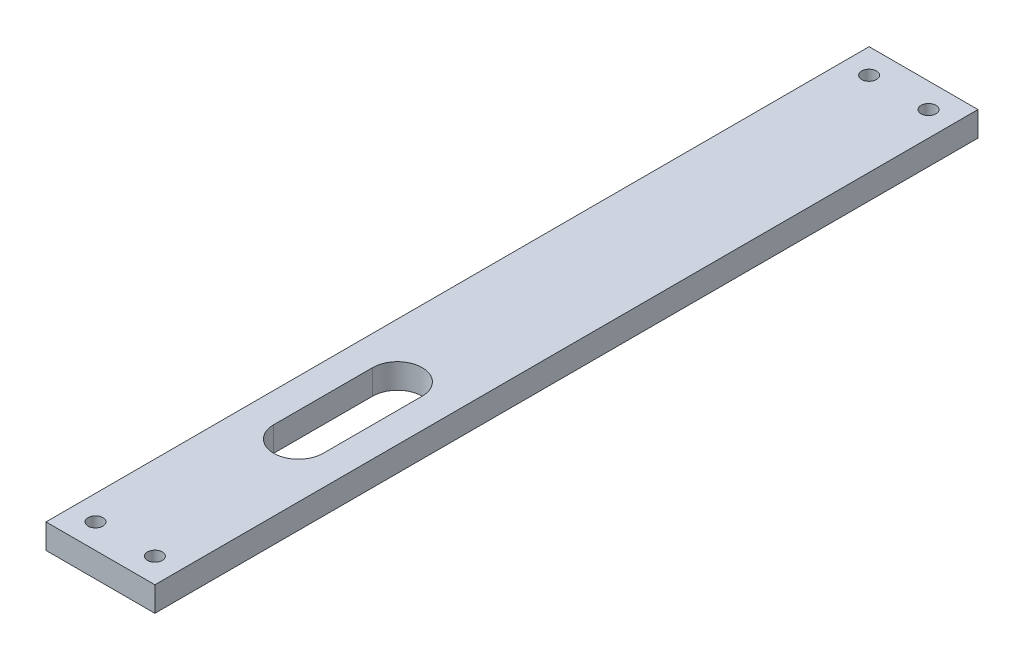
ISO-10303-21;
HEADER;
FILE_DESCRIPTION(('STEP AP214'),'2;1');
FILE_NAME('part.step','',(''),(''),'','','');
FILE_SCHEMA(('AUTOMOTIVE_DESIGN { 1 0 10303 214 1 1 1 1 }'));
ENDSEC;
DATA;
#1=APPLICATION_CONTEXT('core data for automotive mechanical design processes');
#2=APPLICATION_PROTOCOL_DEFINITION('international standard','automotive_design',2000,#1);
#3=PRODUCT_CONTEXT('',#1,'mechanical');
#4=PRODUCT('Part','Part','',(#3));
#5=PRODUCT_RELATED_PRODUCT_CATEGORY('part','',(#4));
#6=PRODUCT_DEFINITION_FORMATION('','',#4);
#7=PRODUCT_DEFINITION_CONTEXT('part definition',#1,'design');
#8=PRODUCT_DEFINITION('design','',#6,#7);
#9=PRODUCT_DEFINITION_SHAPE('','',#8);
#10=(LENGTH_UNIT() NAMED_UNIT(*) SI_UNIT(.MILLI.,.METRE.));
#11=(NAMED_UNIT(*) PLANE_ANGLE_UNIT() SI_UNIT($,.RADIAN.));
#12=(NAMED_UNIT(*) SI_UNIT($,.STERADIAN.) SOLID_ANGLE_UNIT());
#13=UNCERTAINTY_MEASURE_WITH_UNIT(LENGTH_MEASURE(1.E-05),#10,'distance_accuracy_value','');
#14=(GEOMETRIC_REPRESENTATION_CONTEXT(3) GLOBAL_UNCERTAINTY_ASSIGNED_CONTEXT((#13)) GLOBAL_UNIT_ASSIGNED_CONTEXT((#10,
#11,#12)) REPRESENTATION_CONTEXT('',''));
#15=CARTESIAN_POINT('',(0.,0.,0.));
#16=DIRECTION('',(0.,0.,1.));
#17=DIRECTION('',(1.,0.,0.));
#18=AXIS2_PLACEMENT_3D('',#15,#16,#17);
#19=CARTESIAN_POINT('',(22.,5.,0.));
#20=DIRECTION('',(-1.,0.,0.));
#21=DIRECTION('',(0.,0.,1.));
#22=AXIS2_PLACEMENT_3D('',#19,#20,#21);
#23=PLANE('',#22);
#24=DIRECTION('',(0.,0.,-1.));
#25=VECTOR('',#24,1.);
#26=CARTESIAN_POINT('',(22.,0.,0.));
#27=LINE('',#26,#25);
#28=CARTESIAN_POINT('',(22.,0.,0.));
#29=VERTEX_POINT('',#28);
#30=CARTESIAN_POINT('',(22.,0.,-166.3));
#31=VERTEX_POINT('',#30);
#32=EDGE_CURVE('E164',#29,#31,#27,.T.);
#33=ORIENTED_EDGE('',*,*,#32,.T.);
#34=DIRECTION('',(0.,-1.,0.));
#35=VECTOR('',#34,1.);
#36=CARTESIAN_POINT('',(22.,5.,-166.3));
#37=LINE('',#36,#35);
#38=CARTESIAN_POINT('',(22.,5.,-166.3));
#39=VERTEX_POINT('',#38);
#40=EDGE_CURVE('E11',#39,#31,#37,.T.);
#41=ORIENTED_EDGE('',*,*,#40,.F.);
#42=DIRECTION('',(0.,0.,-1.));
#43=VECTOR('',#42,1.);
#44=CARTESIAN_POINT('',(22.,5.,0.));
#45=LINE('',#44,#43);
#46=CARTESIAN_POINT('',(22.,5.,0.));
#47=VERTEX_POINT('',#46);
#48=EDGE_CURVE('E142',#47,#39,#45,.T.);
#49=ORIENTED_EDGE('',*,*,#48,.F.);
#50=DIRECTION('',(0.,-1.,0.));
#51=VECTOR('',#50,1.);
#52=CARTESIAN_POINT('',(22.,5.,0.));
#53=LINE('',#52,#51);
#54=EDGE_CURVE('E158',#47,#29,#53,.T.);
#55=ORIENTED_EDGE('',*,*,#54,.T.);
#56=EDGE_LOOP('',(#33,#41,#49,#55));
#57=FACE_BOUND('',#56,.T.);
#58=ADVANCED_FACE('F35',(#57),#23,.F.);
#59=CARTESIAN_POINT('',(0.,5.,-166.3));
#60=DIRECTION('',(0.,0.,-1.));
#61=DIRECTION('',(-1.,0.,0.));
#62=AXIS2_PLACEMENT_3D('',#59,#60,#61);
#63=PLANE('',#62);
#64=DIRECTION('',(1.,0.,0.));
#65=VECTOR('',#64,1.);
#66=CARTESIAN_POINT('',(0.,0.,-166.3));
#67=LINE('',#66,#65);
#68=CARTESIAN_POINT('',(0.,0.,-166.3));
#69=VERTEX_POINT('',#68);
#70=EDGE_CURVE('E167',#69,#31,#67,.T.);
#71=ORIENTED_EDGE('',*,*,#70,.F.);
#72=DIRECTION('',(0.,-1.,0.));
#73=VECTOR('',#72,1.);
#74=CARTESIAN_POINT('',(0.,5.,-166.3));
#75=LINE('',#74,#73);
#76=CARTESIAN_POINT('',(0.,5.,-166.3));
#77=VERTEX_POINT('',#76);
#78=EDGE_CURVE('E43',#77,#69,#75,.T.);
#79=ORIENTED_EDGE('',*,*,#78,.F.);
#80=DIRECTION('',(1.,0.,0.));
#81=VECTOR('',#80,1.);
#82=CARTESIAN_POINT('',(0.,5.,-166.3));
#83=LINE('',#82,#81);
#84=EDGE_CURVE('E144',#77,#39,#83,.T.);
#85=ORIENTED_EDGE('',*,*,#84,.T.);
#86=ORIENTED_EDGE('',*,*,#40,.T.);
#87=EDGE_LOOP('',(#71,#79,#85,#86));
#88=FACE_BOUND('',#87,.T.);
#89=ADVANCED_FACE('F190',(#88),#63,.T.);
#90=CARTESIAN_POINT('',(0.,5.,0.));
#91=DIRECTION('',(-1.,0.,0.));
#92=DIRECTION('',(0.,0.,1.));
#93=AXIS2_PLACEMENT_3D('',#90,#91,#92);
#94=PLANE('',#93);
#95=DIRECTION('',(0.,0.,-1.));
#96=VECTOR('',#95,1.);
#97=CARTESIAN_POINT('',(0.,0.,0.));
#98=LINE('',#97,#96);
#99=CARTESIAN_POINT('',(0.,0.,0.));
#100=VERTEX_POINT('',#99);
#101=EDGE_CURVE('E170',#100,#69,#98,.T.);
#102=ORIENTED_EDGE('',*,*,#101,.F.);
#103=DIRECTION('',(0.,-1.,0.));
#104=VECTOR('',#103,1.);
#105=CARTESIAN_POINT('',(0.,5.,0.));
#106=LINE('',#105,#104);
#107=CARTESIAN_POINT('',(0.,5.,0.));
#108=VERTEX_POINT('',#107);
#109=EDGE_CURVE('E182',#108,#100,#106,.T.);
#110=ORIENTED_EDGE('',*,*,#109,.F.);
#111=DIRECTION('',(0.,0.,-1.));
#112=VECTOR('',#111,1.);
#113=CARTESIAN_POINT('',(0.,5.,0.));
#114=LINE('',#113,#112);
#115=EDGE_CURVE('E147',#108,#77,#114,.T.);
#116=ORIENTED_EDGE('',*,*,#115,.T.);
#117=ORIENTED_EDGE('',*,*,#78,.T.);
#118=EDGE_LOOP('',(#102,#110,#116,#117));
#119=FACE_BOUND('',#118,.T.);
#120=ADVANCED_FACE('F186',(#119),#94,.T.);
#121=CARTESIAN_POINT('',(17.,5.,-5.));
#122=DIRECTION('',(0.,-1.,0.));
#123=DIRECTION('',(0.,0.,-1.));
#124=AXIS2_PLACEMENT_3D('',#121,#122,#123);
#125=CYLINDRICAL_SURFACE('',#124,1.5);
#126=CARTESIAN_POINT('',(17.,5.,-5.));
#127=DIRECTION('',(0.,1.,0.));
#128=DIRECTION('',(0.,0.,1.));
#129=AXIS2_PLACEMENT_3D('',#126,#127,#128);
#130=CIRCLE('',#129,1.5);
#131=CARTESIAN_POINT('',(17.,5.,-3.5));
#132=VERTEX_POINT('',#131);
#133=EDGE_CURVE('E152',#132,#132,#130,.F.);
#134=ORIENTED_EDGE('',*,*,#133,.F.);
#135=EDGE_LOOP('',(#134));
#136=FACE_BOUND('',#135,.T.);
#137=CARTESIAN_POINT('',(17.,0.,-5.));
#138=DIRECTION('',(0.,1.,0.));
#139=DIRECTION('',(0.,0.,1.));
#140=AXIS2_PLACEMENT_3D('',#137,#138,#139);
#141=CIRCLE('',#140,1.5);
#142=CARTESIAN_POINT('',(17.,0.,-3.5));
#143=VERTEX_POINT('',#142);
#144=EDGE_CURVE('E175',#143,#143,#141,.F.);
#145=ORIENTED_EDGE('',*,*,#144,.T.);
#146=EDGE_LOOP('',(#145));
#147=FACE_BOUND('',#146,.T.);
#148=ADVANCED_FACE('F242',(#136,#147),#125,.F.);
#149=CARTESIAN_POINT('',(0.,5.,0.));
#150=DIRECTION('',(0.,0.,-1.));
#151=DIRECTION('',(-1.,0.,0.));
#152=AXIS2_PLACEMENT_3D('',#149,#150,#151);
#153=PLANE('',#152);
#154=DIRECTION('',(1.,0.,0.));
#155=VECTOR('',#154,1.);
#156=CARTESIAN_POINT('',(0.,0.,0.));
#157=LINE('',#156,#155);
#158=EDGE_CURVE('E173',#100,#29,#157,.T.);
#159=ORIENTED_EDGE('',*,*,#158,.T.);
#160=ORIENTED_EDGE('',*,*,#54,.F.);
#161=DIRECTION('',(1.,0.,0.));
#162=VECTOR('',#161,1.);
#163=CARTESIAN_POINT('',(0.,5.,0.));
#164=LINE('',#163,#162);
#165=EDGE_CURVE('E150',#108,#47,#164,.T.);
#166=ORIENTED_EDGE('',*,*,#165,.F.);
#167=ORIENTED_EDGE('',*,*,#109,.T.);
#168=EDGE_LOOP('',(#159,#160,#166,#167));
#169=FACE_BOUND('',#168,.T.);
#170=ADVANCED_FACE('F199',(#169),#153,.F.);
#171=CARTESIAN_POINT('',(5.,5.,-161.3));
#172=DIRECTION('',(0.,-1.,0.));
#173=DIRECTION('',(0.,0.,-1.));
#174=AXIS2_PLACEMENT_3D('',#171,#172,#173);
#175=CYLINDRICAL_SURFACE('',#174,1.5);
#176=CARTESIAN_POINT('',(5.,5.,-161.3));
#177=DIRECTION('',(0.,1.,0.));
#178=DIRECTION('',(0.,0.,1.));
#179=AXIS2_PLACEMENT_3D('',#176,#177,#178);
#180=CIRCLE('',#179,1.5);
#181=CARTESIAN_POINT('',(5.,5.,-159.8));
#182=VERTEX_POINT('',#181);
#183=EDGE_CURVE('E138',#182,#182,#180,.T.);
#184=ORIENTED_EDGE('',*,*,#183,.T.);
#185=EDGE_LOOP('',(#184));
#186=FACE_BOUND('',#185,.T.);
#187=CARTESIAN_POINT('',(5.,0.,-161.3));
#188=DIRECTION('',(0.,1.,0.));
#189=DIRECTION('',(0.,0.,1.));
#190=AXIS2_PLACEMENT_3D('',#187,#188,#189);
#191=CIRCLE('',#190,1.5);
#192=CARTESIAN_POINT('',(5.,0.,-159.8));
#193=VERTEX_POINT('',#192);
#194=EDGE_CURVE('E161',#193,#193,#191,.T.);
#195=ORIENTED_EDGE('',*,*,#194,.F.);
#196=EDGE_LOOP('',(#195));
#197=FACE_BOUND('',#196,.T.);
#198=ADVANCED_FACE('F234',(#186,#197),#175,.F.);
#199=CARTESIAN_POINT('',(17.,5.,-161.3));
#200=DIRECTION('',(0.,-1.,0.));
#201=DIRECTION('',(0.,0.,-1.));
#202=AXIS2_PLACEMENT_3D('',#199,#200,#201);
#203=CYLINDRICAL_SURFACE('',#202,1.5);
#204=CARTESIAN_POINT('',(17.,5.,-161.3));
#205=DIRECTION('',(0.,1.,0.));
#206=DIRECTION('',(0.,0.,1.));
#207=AXIS2_PLACEMENT_3D('',#204,#205,#206);
#208=CIRCLE('',#207,1.5);
#209=CARTESIAN_POINT('',(17.,5.,-159.8));
#210=VERTEX_POINT('',#209);
#211=EDGE_CURVE('E135',#210,#210,#208,.T.);
#212=ORIENTED_EDGE('',*,*,#211,.T.);
#213=EDGE_LOOP('',(#212));
#214=FACE_BOUND('',#213,.T.);
#215=CARTESIAN_POINT('',(17.,0.,-161.3));
#216=DIRECTION('',(0.,1.,0.));
#217=DIRECTION('',(0.,0.,1.));
#218=AXIS2_PLACEMENT_3D('',#215,#216,#217);
#219=CIRCLE('',#218,1.5);
#220=CARTESIAN_POINT('',(17.,0.,-159.8));
#221=VERTEX_POINT('',#220);
#222=EDGE_CURVE('E131',#221,#221,#219,.T.);
#223=ORIENTED_EDGE('',*,*,#222,.F.);
#224=EDGE_LOOP('',(#223));
#225=FACE_BOUND('',#224,.T.);
#226=ADVANCED_FACE('F37',(#214,#225),#203,.F.);
#227=CARTESIAN_POINT('',(5.,5.,-5.));
#228=DIRECTION('',(0.,-1.,0.));
#229=DIRECTION('',(0.,0.,-1.));
#230=AXIS2_PLACEMENT_3D('',#227,#228,#229);
#231=CYLINDRICAL_SURFACE('',#230,1.5);
#232=CARTESIAN_POINT('',(5.,5.,-5.));
#233=DIRECTION('',(0.,1.,0.));
#234=DIRECTION('',(0.,0.,1.));
#235=AXIS2_PLACEMENT_3D('',#232,#233,#234);
#236=CIRCLE('',#235,1.5);
#237=CARTESIAN_POINT('',(5.,5.,-3.5));
#238=VERTEX_POINT('',#237);
#239=EDGE_CURVE('E155',#238,#238,#236,.F.);
#240=ORIENTED_EDGE('',*,*,#239,.F.);
#241=EDGE_LOOP('',(#240));
#242=FACE_BOUND('',#241,.T.);
#243=CARTESIAN_POINT('',(5.,0.,-5.));
#244=DIRECTION('',(0.,1.,0.));
#245=DIRECTION('',(0.,0.,1.));
#246=AXIS2_PLACEMENT_3D('',#243,#244,#245);
#247=CIRCLE('',#246,1.5);
#248=CARTESIAN_POINT('',(5.,0.,-3.5));
#249=VERTEX_POINT('',#248);
#250=EDGE_CURVE('E139',#249,#249,#247,.F.);
#251=ORIENTED_EDGE('',*,*,#250,.T.);
#252=EDGE_LOOP('',(#251));
#253=FACE_BOUND('',#252,.T.);
#254=ADVANCED_FACE('F206',(#242,#253),#231,.F.);
#255=CARTESIAN_POINT('',(0.,5.,0.));
#256=DIRECTION('',(0.,1.,0.));
#257=DIRECTION('',(0.,0.,1.));
#258=AXIS2_PLACEMENT_3D('',#255,#256,#257);
#259=PLANE('',#258);
#260=DIRECTION('',(0.,0.,-1.));
#261=VECTOR('',#260,1.);
#262=CARTESIAN_POINT('',(6.,5.,0.));
#263=LINE('',#262,#261);
#264=CARTESIAN_POINT('',(6.,5.,-40.));
#265=VERTEX_POINT('',#264);
#266=CARTESIAN_POINT('',(6.,5.,-60.));
#267=VERTEX_POINT('',#266);
#268=EDGE_CURVE('E101',#265,#267,#263,.T.);
#269=ORIENTED_EDGE('',*,*,#268,.T.);
#270=CARTESIAN_POINT('',(11.,5.,-60.));
#271=DIRECTION('',(0.,-1.,0.));
#272=DIRECTION('',(0.,0.,-1.));
#273=AXIS2_PLACEMENT_3D('',#270,#271,#272);
#274=CIRCLE('',#273,5.);
#275=CARTESIAN_POINT('',(16.,5.,-60.));
#276=VERTEX_POINT('',#275);
#277=EDGE_CURVE('E107',#267,#276,#274,.T.);
#278=ORIENTED_EDGE('',*,*,#277,.T.);
#279=DIRECTION('',(0.,0.,-1.));
#280=VECTOR('',#279,1.);
#281=CARTESIAN_POINT('',(16.,5.,0.));
#282=LINE('',#281,#280);
#283=CARTESIAN_POINT('',(16.,5.,-40.));
#284=VERTEX_POINT('',#283);
#285=EDGE_CURVE('E111',#284,#276,#282,.T.);
#286=ORIENTED_EDGE('',*,*,#285,.F.);
#287=CARTESIAN_POINT('',(11.,5.,-40.));
#288=DIRECTION('',(0.,-1.,0.));
#289=DIRECTION('',(0.,0.,-1.));
#290=AXIS2_PLACEMENT_3D('',#287,#288,#289);
#291=CIRCLE('',#290,5.);
#292=EDGE_CURVE('E104',#284,#265,#291,.T.);
#293=ORIENTED_EDGE('',*,*,#292,.T.);
#294=EDGE_LOOP('',(#269,#278,#286,#293));
#295=FACE_BOUND('',#294,.T.);
#296=ORIENTED_EDGE('',*,*,#211,.F.);
#297=EDGE_LOOP('',(#296));
#298=FACE_BOUND('',#297,.T.);
#299=ORIENTED_EDGE('',*,*,#183,.F.);
#300=EDGE_LOOP('',(#299));
#301=FACE_BOUND('',#300,.T.);
#302=ORIENTED_EDGE('',*,*,#48,.T.);
#303=ORIENTED_EDGE('',*,*,#84,.F.);
#304=ORIENTED_EDGE('',*,*,#115,.F.);
#305=ORIENTED_EDGE('',*,*,#165,.T.);
#306=EDGE_LOOP('',(#302,#303,#304,#305));
#307=FACE_BOUND('',#306,.T.);
#308=ORIENTED_EDGE('',*,*,#133,.T.);
#309=EDGE_LOOP('',(#308));
#310=FACE_BOUND('',#309,.T.);
#311=ORIENTED_EDGE('',*,*,#239,.T.);
#312=EDGE_LOOP('',(#311));
#313=FACE_BOUND('',#312,.T.);
#314=ADVANCED_FACE('F113',(#295,#298,#301,#307,#310,#313),#259,.T.);
#315=CARTESIAN_POINT('',(0.,0.,0.));
#316=DIRECTION('',(0.,1.,0.));
#317=DIRECTION('',(0.,0.,1.));
#318=AXIS2_PLACEMENT_3D('',#315,#316,#317);
#319=PLANE('',#318);
#320=CARTESIAN_POINT('',(11.,0.,-60.));
#321=DIRECTION('',(0.,-1.,0.));
#322=DIRECTION('',(0.,0.,-1.));
#323=AXIS2_PLACEMENT_3D('',#320,#321,#322);
#324=CIRCLE('',#323,5.);
#325=CARTESIAN_POINT('',(6.,0.,-60.));
#326=VERTEX_POINT('',#325);
#327=CARTESIAN_POINT('',(16.,0.,-60.));
#328=VERTEX_POINT('',#327);
#329=EDGE_CURVE('E125',#326,#328,#324,.T.);
#330=ORIENTED_EDGE('',*,*,#329,.F.);
#331=DIRECTION('',(0.,0.,-1.));
#332=VECTOR('',#331,1.);
#333=CARTESIAN_POINT('',(6.,0.,0.));
#334=LINE('',#333,#332);
#335=CARTESIAN_POINT('',(6.,0.,-40.));
#336=VERTEX_POINT('',#335);
#337=EDGE_CURVE('E58',#336,#326,#334,.T.);
#338=ORIENTED_EDGE('',*,*,#337,.F.);
#339=CARTESIAN_POINT('',(11.,0.,-40.));
#340=DIRECTION('',(0.,-1.,0.));
#341=DIRECTION('',(0.,0.,-1.));
#342=AXIS2_PLACEMENT_3D('',#339,#340,#341);
#343=CIRCLE('',#342,5.);
#344=CARTESIAN_POINT('',(16.,0.,-40.));
#345=VERTEX_POINT('',#344);
#346=EDGE_CURVE('E116',#345,#336,#343,.T.);
#347=ORIENTED_EDGE('',*,*,#346,.F.);
#348=DIRECTION('',(0.,0.,-1.));
#349=VECTOR('',#348,1.);
#350=CARTESIAN_POINT('',(16.,0.,0.));
#351=LINE('',#350,#349);
#352=EDGE_CURVE('E119',#345,#328,#351,.T.);
#353=ORIENTED_EDGE('',*,*,#352,.T.);
#354=EDGE_LOOP('',(#330,#338,#347,#353));
#355=FACE_BOUND('',#354,.T.);
#356=ORIENTED_EDGE('',*,*,#222,.T.);
#357=EDGE_LOOP('',(#356));
#358=FACE_BOUND('',#357,.T.);
#359=ORIENTED_EDGE('',*,*,#194,.T.);
#360=EDGE_LOOP('',(#359));
#361=FACE_BOUND('',#360,.T.);
#362=ORIENTED_EDGE('',*,*,#32,.F.);
#363=ORIENTED_EDGE('',*,*,#158,.F.);
#364=ORIENTED_EDGE('',*,*,#101,.T.);
#365=ORIENTED_EDGE('',*,*,#70,.T.);
#366=EDGE_LOOP('',(#362,#363,#364,#365));
#367=FACE_BOUND('',#366,.T.);
#368=ORIENTED_EDGE('',*,*,#144,.F.);
#369=EDGE_LOOP('',(#368));
#370=FACE_BOUND('',#369,.T.);
#371=ORIENTED_EDGE('',*,*,#250,.F.);
#372=EDGE_LOOP('',(#371));
#373=FACE_BOUND('',#372,.T.);
#374=ADVANCED_FACE('F195',(#355,#358,#361,#367,#370,#373),#319,.F.);
#375=CARTESIAN_POINT('',(6.,5.,0.));
#376=DIRECTION('',(-1.,0.,0.));
#377=DIRECTION('',(0.,0.,1.));
#378=AXIS2_PLACEMENT_3D('',#375,#376,#377);
#379=PLANE('',#378);
#380=ORIENTED_EDGE('',*,*,#337,.T.);
#381=DIRECTION('',(0.,-1.,0.));
#382=VECTOR('',#381,1.);
#383=CARTESIAN_POINT('',(6.,5.,-60.));
#384=LINE('',#383,#382);
#385=EDGE_CURVE('E98',#267,#326,#384,.T.);
#386=ORIENTED_EDGE('',*,*,#385,.F.);
#387=ORIENTED_EDGE('',*,*,#268,.F.);
#388=DIRECTION('',(0.,-1.,0.));
#389=VECTOR('',#388,1.);
#390=CARTESIAN_POINT('',(6.,5.,-40.));
#391=LINE('',#390,#389);
#392=EDGE_CURVE('E129',#265,#336,#391,.T.);
#393=ORIENTED_EDGE('',*,*,#392,.T.);
#394=EDGE_LOOP('',(#380,#386,#387,#393));
#395=FACE_BOUND('',#394,.T.);
#396=ADVANCED_FACE('F99',(#395),#379,.F.);
#397=CARTESIAN_POINT('',(11.,5.,-40.));
#398=DIRECTION('',(0.,-1.,0.));
#399=DIRECTION('',(0.,0.,-1.));
#400=AXIS2_PLACEMENT_3D('',#397,#398,#399);
#401=CYLINDRICAL_SURFACE('',#400,5.);
#402=ORIENTED_EDGE('',*,*,#346,.T.);
#403=ORIENTED_EDGE('',*,*,#392,.F.);
#404=ORIENTED_EDGE('',*,*,#292,.F.);
#405=DIRECTION('',(0.,-1.,0.));
#406=VECTOR('',#405,1.);
#407=CARTESIAN_POINT('',(16.,5.,-40.));
#408=LINE('',#407,#406);
#409=EDGE_CURVE('E132',#284,#345,#408,.T.);
#410=ORIENTED_EDGE('',*,*,#409,.T.);
#411=EDGE_LOOP('',(#402,#403,#404,#410));
#412=FACE_BOUND('',#411,.T.);
#413=ADVANCED_FACE('F224',(#412),#401,.F.);
#414=CARTESIAN_POINT('',(16.,5.,0.));
#415=DIRECTION('',(-1.,0.,0.));
#416=DIRECTION('',(0.,0.,1.));
#417=AXIS2_PLACEMENT_3D('',#414,#415,#416);
#418=PLANE('',#417);
#419=ORIENTED_EDGE('',*,*,#352,.F.);
#420=ORIENTED_EDGE('',*,*,#409,.F.);
#421=ORIENTED_EDGE('',*,*,#285,.T.);
#422=DIRECTION('',(0.,-1.,0.));
#423=VECTOR('',#422,1.);
#424=CARTESIAN_POINT('',(16.,5.,-60.));
#425=LINE('',#424,#423);
#426=EDGE_CURVE('E50',#276,#328,#425,.T.);
#427=ORIENTED_EDGE('',*,*,#426,.T.);
#428=EDGE_LOOP('',(#419,#420,#421,#427));
#429=FACE_BOUND('',#428,.T.);
#430=ADVANCED_FACE('F306',(#429),#418,.T.);
#431=CARTESIAN_POINT('',(11.,5.,-60.));
#432=DIRECTION('',(0.,-1.,0.));
#433=DIRECTION('',(0.,0.,-1.));
#434=AXIS2_PLACEMENT_3D('',#431,#432,#433);
#435=CYLINDRICAL_SURFACE('',#434,5.);
#436=ORIENTED_EDGE('',*,*,#329,.T.);
#437=ORIENTED_EDGE('',*,*,#426,.F.);
#438=ORIENTED_EDGE('',*,*,#277,.F.);
#439=ORIENTED_EDGE('',*,*,#385,.T.);
#440=EDGE_LOOP('',(#436,#437,#438,#439));
#441=FACE_BOUND('',#440,.T.);
#442=ADVANCED_FACE('F108',(#441),#435,.F.);
#443=CLOSED_SHELL('',(#58,#89,#120,#148,#170,#198,#226,#254,#314,#374,#396,#413,#430,#442));
#444=MANIFOLD_SOLID_BREP('B2',#443);
#445=ADVANCED_BREP_SHAPE_REPRESENTATION('',(#18,#444),#14);
#446=SHAPE_DEFINITION_REPRESENTATION(#9,#445);
ENDSEC;
END-ISO-10303-21;
